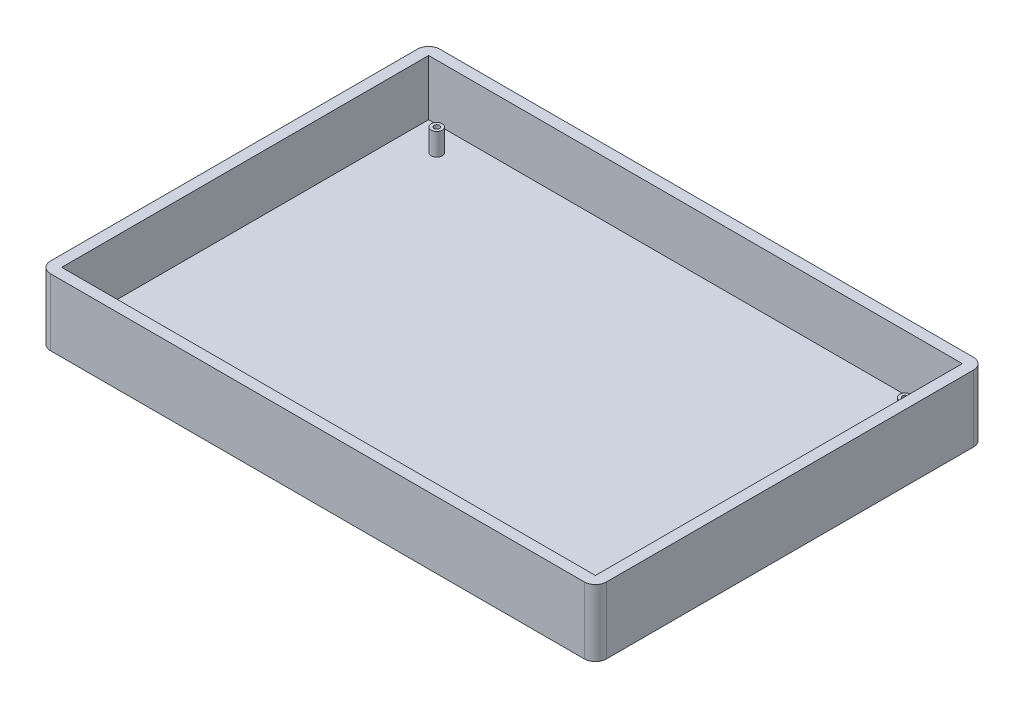
ISO-10303-21;
HEADER;
FILE_DESCRIPTION(('STEP AP214'),'2;1');
FILE_NAME('part.step','',(''),(''),'','','');
FILE_SCHEMA(('AUTOMOTIVE_DESIGN { 1 0 10303 214 1 1 1 1 }'));
ENDSEC;
DATA;
#1=APPLICATION_CONTEXT('core data for automotive mechanical design processes');
#2=APPLICATION_PROTOCOL_DEFINITION('international standard','automotive_design',2000,#1);
#3=PRODUCT_CONTEXT('',#1,'mechanical');
#4=PRODUCT('Part','Part','',(#3));
#5=PRODUCT_RELATED_PRODUCT_CATEGORY('part','',(#4));
#6=PRODUCT_DEFINITION_FORMATION('','',#4);
#7=PRODUCT_DEFINITION_CONTEXT('part definition',#1,'design');
#8=PRODUCT_DEFINITION('design','',#6,#7);
#9=PRODUCT_DEFINITION_SHAPE('','',#8);
#10=(LENGTH_UNIT() NAMED_UNIT(*) SI_UNIT(.MILLI.,.METRE.));
#11=(NAMED_UNIT(*) PLANE_ANGLE_UNIT() SI_UNIT($,.RADIAN.));
#12=(NAMED_UNIT(*) SI_UNIT($,.STERADIAN.) SOLID_ANGLE_UNIT());
#13=UNCERTAINTY_MEASURE_WITH_UNIT(LENGTH_MEASURE(1.E-05),#10,'distance_accuracy_value','');
#14=(GEOMETRIC_REPRESENTATION_CONTEXT(3) GLOBAL_UNCERTAINTY_ASSIGNED_CONTEXT((#13)) GLOBAL_UNIT_ASSIGNED_CONTEXT((#10,
#11,#12)) REPRESENTATION_CONTEXT('',''));
#15=CARTESIAN_POINT('',(0.,0.,0.));
#16=DIRECTION('',(0.,0.,1.));
#17=DIRECTION('',(1.,0.,0.));
#18=AXIS2_PLACEMENT_3D('',#15,#16,#17);
#19=CARTESIAN_POINT('',(125.,30.,87.5));
#20=DIRECTION('',(-1.,0.,0.));
#21=DIRECTION('',(0.,0.,1.));
#22=AXIS2_PLACEMENT_3D('',#19,#20,#21);
#23=PLANE('',#22);
#24=DIRECTION('',(0.,0.,-1.));
#25=VECTOR('',#24,1.);
#26=CARTESIAN_POINT('',(125.,30.,87.5));
#27=LINE('',#26,#25);
#28=CARTESIAN_POINT('',(125.,30.,82.5));
#29=VERTEX_POINT('',#28);
#30=CARTESIAN_POINT('',(125.,30.,-82.5));
#31=VERTEX_POINT('',#30);
#32=EDGE_CURVE('E186',#29,#31,#27,.T.);
#33=ORIENTED_EDGE('',*,*,#32,.F.);
#34=DIRECTION('',(0.,-1.,0.));
#35=VECTOR('',#34,1.);
#36=CARTESIAN_POINT('',(125.,30.,82.5));
#37=LINE('',#36,#35);
#38=CARTESIAN_POINT('',(125.,0.,82.5));
#39=VERTEX_POINT('',#38);
#40=EDGE_CURVE('E218',#29,#39,#37,.T.);
#41=ORIENTED_EDGE('',*,*,#40,.T.);
#42=DIRECTION('',(0.,0.,-1.));
#43=VECTOR('',#42,1.);
#44=CARTESIAN_POINT('',(125.,0.,87.5));
#45=LINE('',#44,#43);
#46=CARTESIAN_POINT('',(125.,0.,-82.5));
#47=VERTEX_POINT('',#46);
#48=EDGE_CURVE('E180',#39,#47,#45,.T.);
#49=ORIENTED_EDGE('',*,*,#48,.T.);
#50=DIRECTION('',(0.,-1.,0.));
#51=VECTOR('',#50,1.);
#52=CARTESIAN_POINT('',(125.,30.,-82.5));
#53=LINE('',#52,#51);
#54=EDGE_CURVE('E202',#47,#31,#53,.F.);
#55=ORIENTED_EDGE('',*,*,#54,.T.);
#56=EDGE_LOOP('',(#33,#41,#49,#55));
#57=FACE_BOUND('',#56,.T.);
#58=ADVANCED_FACE('F39',(#57),#23,.F.);
#59=CARTESIAN_POINT('',(-125.,30.,-87.5));
#60=DIRECTION('',(0.,0.,1.));
#61=DIRECTION('',(1.,0.,0.));
#62=AXIS2_PLACEMENT_3D('',#59,#60,#61);
#63=PLANE('',#62);
#64=DIRECTION('',(-1.,0.,0.));
#65=VECTOR('',#64,1.);
#66=CARTESIAN_POINT('',(-125.,30.,-87.5));
#67=LINE('',#66,#65);
#68=CARTESIAN_POINT('',(120.,30.,-87.5));
#69=VERTEX_POINT('',#68);
#70=CARTESIAN_POINT('',(-120.,30.,-87.5));
#71=VERTEX_POINT('',#70);
#72=EDGE_CURVE('E190',#69,#71,#67,.T.);
#73=ORIENTED_EDGE('',*,*,#72,.F.);
#74=DIRECTION('',(0.,-1.,0.));
#75=VECTOR('',#74,1.);
#76=CARTESIAN_POINT('',(120.,30.,-87.5));
#77=LINE('',#76,#75);
#78=CARTESIAN_POINT('',(120.,0.,-87.5));
#79=VERTEX_POINT('',#78);
#80=EDGE_CURVE('E262',#69,#79,#77,.T.);
#81=ORIENTED_EDGE('',*,*,#80,.T.);
#82=DIRECTION('',(-1.,0.,0.));
#83=VECTOR('',#82,1.);
#84=CARTESIAN_POINT('',(-125.,0.,-87.5));
#85=LINE('',#84,#83);
#86=CARTESIAN_POINT('',(-120.,0.,-87.5));
#87=VERTEX_POINT('',#86);
#88=EDGE_CURVE('E206',#79,#87,#85,.T.);
#89=ORIENTED_EDGE('',*,*,#88,.T.);
#90=DIRECTION('',(0.,-1.,0.));
#91=VECTOR('',#90,1.);
#92=CARTESIAN_POINT('',(-120.,30.,-87.5));
#93=LINE('',#92,#91);
#94=EDGE_CURVE('E259',#87,#71,#93,.F.);
#95=ORIENTED_EDGE('',*,*,#94,.T.);
#96=EDGE_LOOP('',(#73,#81,#89,#95));
#97=FACE_BOUND('',#96,.T.);
#98=ADVANCED_FACE('F306',(#97),#63,.F.);
#99=CARTESIAN_POINT('',(-125.,30.,87.5));
#100=DIRECTION('',(1.,0.,0.));
#101=DIRECTION('',(0.,0.,-1.));
#102=AXIS2_PLACEMENT_3D('',#99,#100,#101);
#103=PLANE('',#102);
#104=DIRECTION('',(0.,0.,1.));
#105=VECTOR('',#104,1.);
#106=CARTESIAN_POINT('',(-125.,0.,87.5));
#107=LINE('',#106,#105);
#108=CARTESIAN_POINT('',(-125.,0.,-82.5));
#109=VERTEX_POINT('',#108);
#110=CARTESIAN_POINT('',(-125.,0.,82.5));
#111=VERTEX_POINT('',#110);
#112=EDGE_CURVE('E210',#109,#111,#107,.T.);
#113=ORIENTED_EDGE('',*,*,#112,.T.);
#114=DIRECTION('',(0.,-1.,0.));
#115=VECTOR('',#114,1.);
#116=CARTESIAN_POINT('',(-125.,30.,82.5));
#117=LINE('',#116,#115);
#118=CARTESIAN_POINT('',(-125.,30.,82.5));
#119=VERTEX_POINT('',#118);
#120=EDGE_CURVE('E63',#111,#119,#117,.F.);
#121=ORIENTED_EDGE('',*,*,#120,.T.);
#122=DIRECTION('',(0.,0.,1.));
#123=VECTOR('',#122,1.);
#124=CARTESIAN_POINT('',(-125.,30.,87.5));
#125=LINE('',#124,#123);
#126=CARTESIAN_POINT('',(-125.,30.,-82.5));
#127=VERTEX_POINT('',#126);
#128=EDGE_CURVE('E195',#127,#119,#125,.T.);
#129=ORIENTED_EDGE('',*,*,#128,.F.);
#130=DIRECTION('',(0.,-1.,0.));
#131=VECTOR('',#130,1.);
#132=CARTESIAN_POINT('',(-125.,30.,-82.5));
#133=LINE('',#132,#131);
#134=EDGE_CURVE('E253',#127,#109,#133,.T.);
#135=ORIENTED_EDGE('',*,*,#134,.T.);
#136=EDGE_LOOP('',(#113,#121,#129,#135));
#137=FACE_BOUND('',#136,.T.);
#138=ADVANCED_FACE('F312',(#137),#103,.F.);
#139=CARTESIAN_POINT('',(-125.,30.,87.5));
#140=DIRECTION('',(0.,0.,-1.));
#141=DIRECTION('',(-1.,0.,0.));
#142=AXIS2_PLACEMENT_3D('',#139,#140,#141);
#143=PLANE('',#142);
#144=DIRECTION('',(1.,0.,0.));
#145=VECTOR('',#144,1.);
#146=CARTESIAN_POINT('',(-125.,0.,87.5));
#147=LINE('',#146,#145);
#148=CARTESIAN_POINT('',(-120.,0.,87.5));
#149=VERTEX_POINT('',#148);
#150=CARTESIAN_POINT('',(120.,0.,87.5));
#151=VERTEX_POINT('',#150);
#152=EDGE_CURVE('E191',#149,#151,#147,.T.);
#153=ORIENTED_EDGE('',*,*,#152,.T.);
#154=DIRECTION('',(0.,-1.,0.));
#155=VECTOR('',#154,1.);
#156=CARTESIAN_POINT('',(120.,30.,87.5));
#157=LINE('',#156,#155);
#158=CARTESIAN_POINT('',(120.,30.,87.5));
#159=VERTEX_POINT('',#158);
#160=EDGE_CURVE('E238',#151,#159,#157,.F.);
#161=ORIENTED_EDGE('',*,*,#160,.T.);
#162=DIRECTION('',(1.,0.,0.));
#163=VECTOR('',#162,1.);
#164=CARTESIAN_POINT('',(-125.,30.,87.5));
#165=LINE('',#164,#163);
#166=CARTESIAN_POINT('',(-120.,30.,87.5));
#167=VERTEX_POINT('',#166);
#168=EDGE_CURVE('E198',#167,#159,#165,.T.);
#169=ORIENTED_EDGE('',*,*,#168,.F.);
#170=DIRECTION('',(0.,-1.,0.));
#171=VECTOR('',#170,1.);
#172=CARTESIAN_POINT('',(-120.,30.,87.5));
#173=LINE('',#172,#171);
#174=EDGE_CURVE('E234',#167,#149,#173,.T.);
#175=ORIENTED_EDGE('',*,*,#174,.T.);
#176=EDGE_LOOP('',(#153,#161,#169,#175));
#177=FACE_BOUND('',#176,.T.);
#178=ADVANCED_FACE('F351',(#177),#143,.F.);
#179=CARTESIAN_POINT('',(0.,30.,0.));
#180=DIRECTION('',(0.,-1.,0.));
#181=DIRECTION('',(0.,0.,-1.));
#182=AXIS2_PLACEMENT_3D('',#179,#180,#181);
#183=PLANE('',#182);
#184=DIRECTION('',(-1.,0.,0.));
#185=VECTOR('',#184,1.);
#186=CARTESIAN_POINT('',(120.,30.,-82.5));
#187=LINE('',#186,#185);
#188=CARTESIAN_POINT('',(120.,30.,-82.5));
#189=VERTEX_POINT('',#188);
#190=CARTESIAN_POINT('',(-120.,30.,-82.5));
#191=VERTEX_POINT('',#190);
#192=EDGE_CURVE('E170',#189,#191,#187,.T.);
#193=ORIENTED_EDGE('',*,*,#192,.F.);
#194=DIRECTION('',(0.,0.,-1.));
#195=VECTOR('',#194,1.);
#196=CARTESIAN_POINT('',(120.,30.,82.5));
#197=LINE('',#196,#195);
#198=CARTESIAN_POINT('',(120.,30.,82.5));
#199=VERTEX_POINT('',#198);
#200=EDGE_CURVE('E55',#199,#189,#197,.T.);
#201=ORIENTED_EDGE('',*,*,#200,.F.);
#202=DIRECTION('',(1.,0.,0.));
#203=VECTOR('',#202,1.);
#204=CARTESIAN_POINT('',(-120.,30.,82.5));
#205=LINE('',#204,#203);
#206=CARTESIAN_POINT('',(-120.,30.,82.5));
#207=VERTEX_POINT('',#206);
#208=EDGE_CURVE('E154',#207,#199,#205,.T.);
#209=ORIENTED_EDGE('',*,*,#208,.F.);
#210=DIRECTION('',(0.,0.,1.));
#211=VECTOR('',#210,1.);
#212=CARTESIAN_POINT('',(-120.,30.,-82.5));
#213=LINE('',#212,#211);
#214=EDGE_CURVE('E158',#191,#207,#213,.T.);
#215=ORIENTED_EDGE('',*,*,#214,.F.);
#216=EDGE_LOOP('',(#193,#201,#209,#215));
#217=FACE_BOUND('',#216,.T.);
#218=ORIENTED_EDGE('',*,*,#168,.T.);
#219=CARTESIAN_POINT('',(120.,30.,82.5));
#220=DIRECTION('',(0.,-1.,0.));
#221=DIRECTION('',(0.,0.,-1.));
#222=AXIS2_PLACEMENT_3D('',#219,#220,#221);
#223=CIRCLE('',#222,5.);
#224=EDGE_CURVE('E250',#159,#29,#223,.F.);
#225=ORIENTED_EDGE('',*,*,#224,.T.);
#226=ORIENTED_EDGE('',*,*,#32,.T.);
#227=CARTESIAN_POINT('',(120.,30.,-82.5));
#228=DIRECTION('',(0.,-1.,0.));
#229=DIRECTION('',(0.,0.,-1.));
#230=AXIS2_PLACEMENT_3D('',#227,#228,#229);
#231=CIRCLE('',#230,5.);
#232=EDGE_CURVE('E244',#31,#69,#231,.F.);
#233=ORIENTED_EDGE('',*,*,#232,.T.);
#234=ORIENTED_EDGE('',*,*,#72,.T.);
#235=CARTESIAN_POINT('',(-120.,30.,-82.5));
#236=DIRECTION('',(0.,-1.,0.));
#237=DIRECTION('',(0.,0.,-1.));
#238=AXIS2_PLACEMENT_3D('',#235,#236,#237);
#239=CIRCLE('',#238,5.);
#240=EDGE_CURVE('E241',#71,#127,#239,.F.);
#241=ORIENTED_EDGE('',*,*,#240,.T.);
#242=ORIENTED_EDGE('',*,*,#128,.T.);
#243=CARTESIAN_POINT('',(-120.,30.,82.5));
#244=DIRECTION('',(0.,-1.,0.));
#245=DIRECTION('',(0.,0.,-1.));
#246=AXIS2_PLACEMENT_3D('',#243,#244,#245);
#247=CIRCLE('',#246,5.);
#248=EDGE_CURVE('E247',#119,#167,#247,.F.);
#249=ORIENTED_EDGE('',*,*,#248,.T.);
#250=EDGE_LOOP('',(#218,#225,#226,#233,#234,#241,#242,#249));
#251=FACE_BOUND('',#250,.T.);
#252=ADVANCED_FACE('F338',(#217,#251),#183,.F.);
#253=CARTESIAN_POINT('',(0.,0.,0.));
#254=DIRECTION('',(0.,-1.,0.));
#255=DIRECTION('',(0.,0.,-1.));
#256=AXIS2_PLACEMENT_3D('',#253,#254,#255);
#257=PLANE('',#256);
#258=ORIENTED_EDGE('',*,*,#48,.F.);
#259=CARTESIAN_POINT('',(120.,0.,82.5));
#260=DIRECTION('',(0.,-1.,0.));
#261=DIRECTION('',(0.,0.,-1.));
#262=AXIS2_PLACEMENT_3D('',#259,#260,#261);
#263=CIRCLE('',#262,5.);
#264=EDGE_CURVE('E231',#39,#151,#263,.T.);
#265=ORIENTED_EDGE('',*,*,#264,.T.);
#266=ORIENTED_EDGE('',*,*,#152,.F.);
#267=CARTESIAN_POINT('',(-120.,0.,82.5));
#268=DIRECTION('',(0.,-1.,0.));
#269=DIRECTION('',(0.,0.,-1.));
#270=AXIS2_PLACEMENT_3D('',#267,#268,#269);
#271=CIRCLE('',#270,5.);
#272=EDGE_CURVE('E228',#149,#111,#271,.T.);
#273=ORIENTED_EDGE('',*,*,#272,.T.);
#274=ORIENTED_EDGE('',*,*,#112,.F.);
#275=CARTESIAN_POINT('',(-120.,0.,-82.5));
#276=DIRECTION('',(0.,-1.,0.));
#277=DIRECTION('',(0.,0.,-1.));
#278=AXIS2_PLACEMENT_3D('',#275,#276,#277);
#279=CIRCLE('',#278,5.);
#280=EDGE_CURVE('E222',#109,#87,#279,.T.);
#281=ORIENTED_EDGE('',*,*,#280,.T.);
#282=ORIENTED_EDGE('',*,*,#88,.F.);
#283=CARTESIAN_POINT('',(120.,0.,-82.5));
#284=DIRECTION('',(0.,-1.,0.));
#285=DIRECTION('',(0.,0.,-1.));
#286=AXIS2_PLACEMENT_3D('',#283,#284,#285);
#287=CIRCLE('',#286,5.);
#288=EDGE_CURVE('E225',#79,#47,#287,.T.);
#289=ORIENTED_EDGE('',*,*,#288,.T.);
#290=EDGE_LOOP('',(#258,#265,#266,#273,#274,#281,#282,#289));
#291=FACE_BOUND('',#290,.T.);
#292=ADVANCED_FACE('F322',(#291),#257,.T.);
#293=CARTESIAN_POINT('',(120.,30.,82.5));
#294=DIRECTION('',(0.,-1.,0.));
#295=DIRECTION('',(0.,0.,-1.));
#296=AXIS2_PLACEMENT_3D('',#293,#294,#295);
#297=CYLINDRICAL_SURFACE('',#296,5.);
#298=ORIENTED_EDGE('',*,*,#224,.F.);
#299=ORIENTED_EDGE('',*,*,#160,.F.);
#300=ORIENTED_EDGE('',*,*,#264,.F.);
#301=ORIENTED_EDGE('',*,*,#40,.F.);
#302=EDGE_LOOP('',(#298,#299,#300,#301));
#303=FACE_BOUND('',#302,.T.);
#304=ADVANCED_FACE('F318',(#303),#297,.T.);
#305=CARTESIAN_POINT('',(-120.,30.,82.5));
#306=DIRECTION('',(0.,-1.,0.));
#307=DIRECTION('',(0.,0.,-1.));
#308=AXIS2_PLACEMENT_3D('',#305,#306,#307);
#309=CYLINDRICAL_SURFACE('',#308,5.);
#310=ORIENTED_EDGE('',*,*,#248,.F.);
#311=ORIENTED_EDGE('',*,*,#120,.F.);
#312=ORIENTED_EDGE('',*,*,#272,.F.);
#313=ORIENTED_EDGE('',*,*,#174,.F.);
#314=EDGE_LOOP('',(#310,#311,#312,#313));
#315=FACE_BOUND('',#314,.T.);
#316=ADVANCED_FACE('F321',(#315),#309,.T.);
#317=CARTESIAN_POINT('',(120.,30.,-82.5));
#318=DIRECTION('',(0.,-1.,0.));
#319=DIRECTION('',(0.,0.,-1.));
#320=AXIS2_PLACEMENT_3D('',#317,#318,#319);
#321=CYLINDRICAL_SURFACE('',#320,5.);
#322=ORIENTED_EDGE('',*,*,#232,.F.);
#323=ORIENTED_EDGE('',*,*,#54,.F.);
#324=ORIENTED_EDGE('',*,*,#288,.F.);
#325=ORIENTED_EDGE('',*,*,#80,.F.);
#326=EDGE_LOOP('',(#322,#323,#324,#325));
#327=FACE_BOUND('',#326,.T.);
#328=ADVANCED_FACE('F325',(#327),#321,.T.);
#329=CARTESIAN_POINT('',(-120.,30.,-82.5));
#330=DIRECTION('',(0.,-1.,0.));
#331=DIRECTION('',(0.,0.,-1.));
#332=AXIS2_PLACEMENT_3D('',#329,#330,#331);
#333=CYLINDRICAL_SURFACE('',#332,5.);
#334=ORIENTED_EDGE('',*,*,#240,.F.);
#335=ORIENTED_EDGE('',*,*,#94,.F.);
#336=ORIENTED_EDGE('',*,*,#280,.F.);
#337=ORIENTED_EDGE('',*,*,#134,.F.);
#338=EDGE_LOOP('',(#334,#335,#336,#337));
#339=FACE_BOUND('',#338,.T.);
#340=ADVANCED_FACE('F41',(#339),#333,.T.);
#341=CARTESIAN_POINT('',(120.,5.,82.5));
#342=DIRECTION('',(1.,0.,0.));
#343=DIRECTION('',(0.,0.,-1.));
#344=AXIS2_PLACEMENT_3D('',#341,#342,#343);
#345=PLANE('',#344);
#346=ORIENTED_EDGE('',*,*,#200,.T.);
#347=DIRECTION('',(0.,1.,0.));
#348=VECTOR('',#347,1.);
#349=CARTESIAN_POINT('',(120.,5.,-82.5));
#350=LINE('',#349,#348);
#351=CARTESIAN_POINT('',(120.,5.,-82.5));
#352=VERTEX_POINT('',#351);
#353=EDGE_CURVE('E129',#352,#189,#350,.T.);
#354=ORIENTED_EDGE('',*,*,#353,.F.);
#355=DIRECTION('',(0.,0.,-1.));
#356=VECTOR('',#355,1.);
#357=CARTESIAN_POINT('',(120.,5.,82.5));
#358=LINE('',#357,#356);
#359=CARTESIAN_POINT('',(120.,5.,82.5));
#360=VERTEX_POINT('',#359);
#361=EDGE_CURVE('E133',#360,#352,#358,.T.);
#362=ORIENTED_EDGE('',*,*,#361,.F.);
#363=DIRECTION('',(0.,1.,0.));
#364=VECTOR('',#363,1.);
#365=CARTESIAN_POINT('',(120.,5.,82.5));
#366=LINE('',#365,#364);
#367=EDGE_CURVE('E177',#360,#199,#366,.T.);
#368=ORIENTED_EDGE('',*,*,#367,.T.);
#369=EDGE_LOOP('',(#346,#354,#362,#368));
#370=FACE_BOUND('',#369,.T.);
#371=ADVANCED_FACE('F131',(#370),#345,.F.);
#372=CARTESIAN_POINT('',(-120.,5.,82.5));
#373=DIRECTION('',(0.,0.,1.));
#374=DIRECTION('',(1.,0.,0.));
#375=AXIS2_PLACEMENT_3D('',#372,#373,#374);
#376=PLANE('',#375);
#377=ORIENTED_EDGE('',*,*,#208,.T.);
#378=ORIENTED_EDGE('',*,*,#367,.F.);
#379=DIRECTION('',(1.,0.,0.));
#380=VECTOR('',#379,1.);
#381=CARTESIAN_POINT('',(-120.,5.,82.5));
#382=LINE('',#381,#380);
#383=CARTESIAN_POINT('',(-120.,5.,82.5));
#384=VERTEX_POINT('',#383);
#385=EDGE_CURVE('E140',#384,#360,#382,.T.);
#386=ORIENTED_EDGE('',*,*,#385,.F.);
#387=DIRECTION('',(0.,1.,0.));
#388=VECTOR('',#387,1.);
#389=CARTESIAN_POINT('',(-120.,5.,82.5));
#390=LINE('',#389,#388);
#391=EDGE_CURVE('E181',#384,#207,#390,.T.);
#392=ORIENTED_EDGE('',*,*,#391,.T.);
#393=EDGE_LOOP('',(#377,#378,#386,#392));
#394=FACE_BOUND('',#393,.T.);
#395=ADVANCED_FACE('F368',(#394),#376,.F.);
#396=CARTESIAN_POINT('',(-120.,5.,-82.5));
#397=DIRECTION('',(-1.,0.,0.));
#398=DIRECTION('',(0.,0.,1.));
#399=AXIS2_PLACEMENT_3D('',#396,#397,#398);
#400=PLANE('',#399);
#401=ORIENTED_EDGE('',*,*,#214,.T.);
#402=ORIENTED_EDGE('',*,*,#391,.F.);
#403=DIRECTION('',(0.,0.,1.));
#404=VECTOR('',#403,1.);
#405=CARTESIAN_POINT('',(-120.,5.,-82.5));
#406=LINE('',#405,#404);
#407=CARTESIAN_POINT('',(-120.,5.,-82.5));
#408=VERTEX_POINT('',#407);
#409=EDGE_CURVE('E149',#408,#384,#406,.T.);
#410=ORIENTED_EDGE('',*,*,#409,.F.);
#411=DIRECTION('',(0.,1.,0.));
#412=VECTOR('',#411,1.);
#413=CARTESIAN_POINT('',(-120.,5.,-82.5));
#414=LINE('',#413,#412);
#415=EDGE_CURVE('E139',#408,#191,#414,.T.);
#416=ORIENTED_EDGE('',*,*,#415,.T.);
#417=EDGE_LOOP('',(#401,#402,#410,#416));
#418=FACE_BOUND('',#417,.T.);
#419=ADVANCED_FACE('F371',(#418),#400,.F.);
#420=CARTESIAN_POINT('',(120.,5.,-82.5));
#421=DIRECTION('',(0.,0.,-1.));
#422=DIRECTION('',(-1.,0.,0.));
#423=AXIS2_PLACEMENT_3D('',#420,#421,#422);
#424=PLANE('',#423);
#425=ORIENTED_EDGE('',*,*,#192,.T.);
#426=ORIENTED_EDGE('',*,*,#415,.F.);
#427=DIRECTION('',(-1.,0.,0.));
#428=VECTOR('',#427,1.);
#429=CARTESIAN_POINT('',(120.,5.,-82.5));
#430=LINE('',#429,#428);
#431=EDGE_CURVE('E143',#352,#408,#430,.T.);
#432=ORIENTED_EDGE('',*,*,#431,.F.);
#433=ORIENTED_EDGE('',*,*,#353,.T.);
#434=EDGE_LOOP('',(#425,#426,#432,#433));
#435=FACE_BOUND('',#434,.T.);
#436=ADVANCED_FACE('F144',(#435),#424,.F.);
#437=CARTESIAN_POINT('',(0.,5.,0.));
#438=DIRECTION('',(0.,1.,0.));
#439=DIRECTION('',(0.,0.,1.));
#440=AXIS2_PLACEMENT_3D('',#437,#438,#439);
#441=PLANE('',#440);
#442=CARTESIAN_POINT('',(-105.355,5.,71.49));
#443=DIRECTION('',(0.,1.,0.));
#444=DIRECTION('',(0.,0.,1.));
#445=AXIS2_PLACEMENT_3D('',#442,#443,#444);
#446=CIRCLE('',#445,2.5);
#447=CARTESIAN_POINT('',(-105.355,5.,73.99));
#448=VERTEX_POINT('',#447);
#449=EDGE_CURVE('E531',#448,#448,#446,.T.);
#450=ORIENTED_EDGE('',*,*,#449,.F.);
#451=EDGE_LOOP('',(#450));
#452=FACE_BOUND('',#451,.T.);
#453=CARTESIAN_POINT('',(105.355,5.,71.49));
#454=DIRECTION('',(0.,1.,0.));
#455=DIRECTION('',(0.,0.,1.));
#456=AXIS2_PLACEMENT_3D('',#453,#454,#455);
#457=CIRCLE('',#456,2.5);
#458=CARTESIAN_POINT('',(105.355,5.,73.99));
#459=VERTEX_POINT('',#458);
#460=EDGE_CURVE('E545',#459,#459,#457,.T.);
#461=ORIENTED_EDGE('',*,*,#460,.F.);
#462=EDGE_LOOP('',(#461));
#463=FACE_BOUND('',#462,.T.);
#464=CARTESIAN_POINT('',(105.355,5.,-71.49));
#465=DIRECTION('',(0.,1.,0.));
#466=DIRECTION('',(0.,0.,1.));
#467=AXIS2_PLACEMENT_3D('',#464,#465,#466);
#468=CIRCLE('',#467,2.5);
#469=CARTESIAN_POINT('',(105.355,5.,-68.99));
#470=VERTEX_POINT('',#469);
#471=EDGE_CURVE('E557',#470,#470,#468,.T.);
#472=ORIENTED_EDGE('',*,*,#471,.F.);
#473=EDGE_LOOP('',(#472));
#474=FACE_BOUND('',#473,.T.);
#475=CARTESIAN_POINT('',(-105.355,5.,-71.49));
#476=DIRECTION('',(0.,1.,0.));
#477=DIRECTION('',(0.,0.,1.));
#478=AXIS2_PLACEMENT_3D('',#475,#476,#477);
#479=CIRCLE('',#478,2.5);
#480=CARTESIAN_POINT('',(-105.355,5.,-68.99));
#481=VERTEX_POINT('',#480);
#482=EDGE_CURVE('E161',#481,#481,#479,.T.);
#483=ORIENTED_EDGE('',*,*,#482,.F.);
#484=EDGE_LOOP('',(#483));
#485=FACE_BOUND('',#484,.T.);
#486=ORIENTED_EDGE('',*,*,#361,.T.);
#487=ORIENTED_EDGE('',*,*,#431,.T.);
#488=ORIENTED_EDGE('',*,*,#409,.T.);
#489=ORIENTED_EDGE('',*,*,#385,.T.);
#490=EDGE_LOOP('',(#486,#487,#488,#489));
#491=FACE_BOUND('',#490,.T.);
#492=ADVANCED_FACE('F151',(#452,#463,#474,#485,#491),#441,.T.);
#493=CARTESIAN_POINT('',(-105.355,15.,-71.49));
#494=DIRECTION('',(0.,1.,0.));
#495=DIRECTION('',(0.,0.,1.));
#496=AXIS2_PLACEMENT_3D('',#493,#494,#495);
#497=PLANE('',#496);
#498=CARTESIAN_POINT('',(-105.355,15.,-71.49));
#499=DIRECTION('',(0.,1.,0.));
#500=DIRECTION('',(0.,0.,1.));
#501=AXIS2_PLACEMENT_3D('',#498,#499,#500);
#502=CIRCLE('',#501,2.5);
#503=CARTESIAN_POINT('',(-105.355,15.,-68.99));
#504=VERTEX_POINT('',#503);
#505=EDGE_CURVE('E171',#504,#504,#502,.T.);
#506=ORIENTED_EDGE('',*,*,#505,.T.);
#507=EDGE_LOOP('',(#506));
#508=FACE_BOUND('',#507,.T.);
#509=CARTESIAN_POINT('',(-105.355,15.,-71.49));
#510=DIRECTION('',(0.,1.,0.));
#511=DIRECTION('',(0.,0.,1.));
#512=AXIS2_PLACEMENT_3D('',#509,#510,#511);
#513=CIRCLE('',#512,1.25);
#514=CARTESIAN_POINT('',(-105.355,15.,-70.24));
#515=VERTEX_POINT('',#514);
#516=EDGE_CURVE('E562',#515,#515,#513,.T.);
#517=ORIENTED_EDGE('',*,*,#516,.F.);
#518=EDGE_LOOP('',(#517));
#519=FACE_BOUND('',#518,.T.);
#520=ADVANCED_FACE('F396',(#508,#519),#497,.T.);
#521=CARTESIAN_POINT('',(-105.355,15.,-71.49));
#522=DIRECTION('',(0.,-1.,0.));
#523=DIRECTION('',(0.,0.,-1.));
#524=AXIS2_PLACEMENT_3D('',#521,#522,#523);
#525=CYLINDRICAL_SURFACE('',#524,2.5);
#526=ORIENTED_EDGE('',*,*,#505,.F.);
#527=EDGE_LOOP('',(#526));
#528=FACE_BOUND('',#527,.T.);
#529=ORIENTED_EDGE('',*,*,#482,.T.);
#530=EDGE_LOOP('',(#529));
#531=FACE_BOUND('',#530,.T.);
#532=ADVANCED_FACE('F403',(#528,#531),#525,.T.);
#533=CARTESIAN_POINT('',(-105.355,15.,-71.49));
#534=DIRECTION('',(0.,-1.,0.));
#535=DIRECTION('',(0.,0.,-1.));
#536=AXIS2_PLACEMENT_3D('',#533,#534,#535);
#537=CYLINDRICAL_SURFACE('',#536,1.25);
#538=ORIENTED_EDGE('',*,*,#516,.T.);
#539=EDGE_LOOP('',(#538));
#540=FACE_BOUND('',#539,.T.);
#541=CARTESIAN_POINT('',(-105.355,5.,-71.49));
#542=DIRECTION('',(0.,1.,0.));
#543=DIRECTION('',(0.,0.,1.));
#544=AXIS2_PLACEMENT_3D('',#541,#542,#543);
#545=CIRCLE('',#544,1.25);
#546=CARTESIAN_POINT('',(-105.355,5.,-70.24));
#547=VERTEX_POINT('',#546);
#548=EDGE_CURVE('E266',#547,#547,#545,.F.);
#549=ORIENTED_EDGE('',*,*,#548,.T.);
#550=EDGE_LOOP('',(#549));
#551=FACE_BOUND('',#550,.T.);
#552=ADVANCED_FACE('F411',(#540,#551),#537,.F.);
#553=ORIENTED_EDGE('',*,*,#548,.F.);
#554=EDGE_LOOP('',(#553));
#555=FACE_BOUND('',#554,.T.);
#556=ADVANCED_FACE('F301',(#555),#441,.T.);
#557=CARTESIAN_POINT('',(105.355,15.,-71.49));
#558=DIRECTION('',(0.,1.,0.));
#559=DIRECTION('',(0.,0.,1.));
#560=AXIS2_PLACEMENT_3D('',#557,#558,#559);
#561=PLANE('',#560);
#562=CARTESIAN_POINT('',(105.355,15.,-71.49));
#563=DIRECTION('',(0.,1.,0.));
#564=DIRECTION('',(0.,0.,1.));
#565=AXIS2_PLACEMENT_3D('',#562,#563,#564);
#566=CIRCLE('',#565,2.5);
#567=CARTESIAN_POINT('',(105.355,15.,-68.99));
#568=VERTEX_POINT('',#567);
#569=EDGE_CURVE('E558',#568,#568,#566,.T.);
#570=ORIENTED_EDGE('',*,*,#569,.T.);
#571=EDGE_LOOP('',(#570));
#572=FACE_BOUND('',#571,.T.);
#573=CARTESIAN_POINT('',(105.355,15.,-71.49));
#574=DIRECTION('',(0.,1.,0.));
#575=DIRECTION('',(0.,0.,1.));
#576=AXIS2_PLACEMENT_3D('',#573,#574,#575);
#577=CIRCLE('',#576,1.25);
#578=CARTESIAN_POINT('',(105.355,15.,-70.24));
#579=VERTEX_POINT('',#578);
#580=EDGE_CURVE('E550',#579,#579,#577,.T.);
#581=ORIENTED_EDGE('',*,*,#580,.F.);
#582=EDGE_LOOP('',(#581));
#583=FACE_BOUND('',#582,.T.);
#584=ADVANCED_FACE('F425',(#572,#583),#561,.T.);
#585=CARTESIAN_POINT('',(105.355,15.,-71.49));
#586=DIRECTION('',(0.,-1.,0.));
#587=DIRECTION('',(0.,0.,-1.));
#588=AXIS2_PLACEMENT_3D('',#585,#586,#587);
#589=CYLINDRICAL_SURFACE('',#588,2.5);
#590=ORIENTED_EDGE('',*,*,#569,.F.);
#591=EDGE_LOOP('',(#590));
#592=FACE_BOUND('',#591,.T.);
#593=ORIENTED_EDGE('',*,*,#471,.T.);
#594=EDGE_LOOP('',(#593));
#595=FACE_BOUND('',#594,.T.);
#596=ADVANCED_FACE('F432',(#592,#595),#589,.T.);
#597=CARTESIAN_POINT('',(105.355,15.,-71.49));
#598=DIRECTION('',(0.,-1.,0.));
#599=DIRECTION('',(0.,0.,-1.));
#600=AXIS2_PLACEMENT_3D('',#597,#598,#599);
#601=CYLINDRICAL_SURFACE('',#600,1.25);
#602=ORIENTED_EDGE('',*,*,#580,.T.);
#603=EDGE_LOOP('',(#602));
#604=FACE_BOUND('',#603,.T.);
#605=CARTESIAN_POINT('',(105.355,5.,-71.49));
#606=DIRECTION('',(0.,1.,0.));
#607=DIRECTION('',(0.,0.,1.));
#608=AXIS2_PLACEMENT_3D('',#605,#606,#607);
#609=CIRCLE('',#608,1.25);
#610=CARTESIAN_POINT('',(105.355,5.,-70.24));
#611=VERTEX_POINT('',#610);
#612=EDGE_CURVE('E270',#611,#611,#609,.F.);
#613=ORIENTED_EDGE('',*,*,#612,.T.);
#614=EDGE_LOOP('',(#613));
#615=FACE_BOUND('',#614,.T.);
#616=ADVANCED_FACE('F299',(#604,#615),#601,.F.);
#617=ORIENTED_EDGE('',*,*,#612,.F.);
#618=EDGE_LOOP('',(#617));
#619=FACE_BOUND('',#618,.T.);
#620=ADVANCED_FACE('F283',(#619),#441,.T.);
#621=CARTESIAN_POINT('',(105.355,15.,71.49));
#622=DIRECTION('',(0.,1.,0.));
#623=DIRECTION('',(0.,0.,1.));
#624=AXIS2_PLACEMENT_3D('',#621,#622,#623);
#625=PLANE('',#624);
#626=CARTESIAN_POINT('',(105.355,15.,71.49));
#627=DIRECTION('',(0.,1.,0.));
#628=DIRECTION('',(0.,0.,1.));
#629=AXIS2_PLACEMENT_3D('',#626,#627,#628);
#630=CIRCLE('',#629,2.5);
#631=CARTESIAN_POINT('',(105.355,15.,73.99));
#632=VERTEX_POINT('',#631);
#633=EDGE_CURVE('E546',#632,#632,#630,.T.);
#634=ORIENTED_EDGE('',*,*,#633,.T.);
#635=EDGE_LOOP('',(#634));
#636=FACE_BOUND('',#635,.T.);
#637=CARTESIAN_POINT('',(105.355,15.,71.49));
#638=DIRECTION('',(0.,1.,0.));
#639=DIRECTION('',(0.,0.,1.));
#640=AXIS2_PLACEMENT_3D('',#637,#638,#639);
#641=CIRCLE('',#640,1.25);
#642=CARTESIAN_POINT('',(105.355,15.,72.74));
#643=VERTEX_POINT('',#642);
#644=EDGE_CURVE('E540',#643,#643,#641,.T.);
#645=ORIENTED_EDGE('',*,*,#644,.F.);
#646=EDGE_LOOP('',(#645));
#647=FACE_BOUND('',#646,.T.);
#648=ADVANCED_FACE('F298',(#636,#647),#625,.T.);
#649=CARTESIAN_POINT('',(105.355,15.,71.49));
#650=DIRECTION('',(0.,-1.,0.));
#651=DIRECTION('',(0.,0.,-1.));
#652=AXIS2_PLACEMENT_3D('',#649,#650,#651);
#653=CYLINDRICAL_SURFACE('',#652,2.5);
#654=ORIENTED_EDGE('',*,*,#633,.F.);
#655=EDGE_LOOP('',(#654));
#656=FACE_BOUND('',#655,.T.);
#657=ORIENTED_EDGE('',*,*,#460,.T.);
#658=EDGE_LOOP('',(#657));
#659=FACE_BOUND('',#658,.T.);
#660=ADVANCED_FACE('F292',(#656,#659),#653,.T.);
#661=CARTESIAN_POINT('',(105.355,15.,71.49));
#662=DIRECTION('',(0.,-1.,0.));
#663=DIRECTION('',(0.,0.,-1.));
#664=AXIS2_PLACEMENT_3D('',#661,#662,#663);
#665=CYLINDRICAL_SURFACE('',#664,1.25);
#666=ORIENTED_EDGE('',*,*,#644,.T.);
#667=EDGE_LOOP('',(#666));
#668=FACE_BOUND('',#667,.T.);
#669=CARTESIAN_POINT('',(105.355,5.,71.49));
#670=DIRECTION('',(0.,1.,0.));
#671=DIRECTION('',(0.,0.,1.));
#672=AXIS2_PLACEMENT_3D('',#669,#670,#671);
#673=CIRCLE('',#672,1.25);
#674=CARTESIAN_POINT('',(105.355,5.,72.74));
#675=VERTEX_POINT('',#674);
#676=EDGE_CURVE('E48',#675,#675,#673,.F.);
#677=ORIENTED_EDGE('',*,*,#676,.T.);
#678=EDGE_LOOP('',(#677));
#679=FACE_BOUND('',#678,.T.);
#680=ADVANCED_FACE('F277',(#668,#679),#665,.F.);
#681=ORIENTED_EDGE('',*,*,#676,.F.);
#682=EDGE_LOOP('',(#681));
#683=FACE_BOUND('',#682,.T.);
#684=ADVANCED_FACE('F279',(#683),#441,.T.);
#685=CARTESIAN_POINT('',(-105.355,15.,71.49));
#686=DIRECTION('',(0.,1.,0.));
#687=DIRECTION('',(0.,0.,1.));
#688=AXIS2_PLACEMENT_3D('',#685,#686,#687);
#689=PLANE('',#688);
#690=CARTESIAN_POINT('',(-105.355,15.,71.49));
#691=DIRECTION('',(0.,1.,0.));
#692=DIRECTION('',(0.,0.,1.));
#693=AXIS2_PLACEMENT_3D('',#690,#691,#692);
#694=CIRCLE('',#693,2.5);
#695=CARTESIAN_POINT('',(-105.355,15.,73.99));
#696=VERTEX_POINT('',#695);
#697=EDGE_CURVE('E535',#696,#696,#694,.T.);
#698=ORIENTED_EDGE('',*,*,#697,.T.);
#699=EDGE_LOOP('',(#698));
#700=FACE_BOUND('',#699,.T.);
#701=CARTESIAN_POINT('',(-105.355,15.,71.49));
#702=DIRECTION('',(0.,1.,0.));
#703=DIRECTION('',(0.,0.,1.));
#704=AXIS2_PLACEMENT_3D('',#701,#702,#703);
#705=CIRCLE('',#704,1.25);
#706=CARTESIAN_POINT('',(-105.355,15.,72.74));
#707=VERTEX_POINT('',#706);
#708=EDGE_CURVE('E527',#707,#707,#705,.T.);
#709=ORIENTED_EDGE('',*,*,#708,.F.);
#710=EDGE_LOOP('',(#709));
#711=FACE_BOUND('',#710,.T.);
#712=ADVANCED_FACE('F281',(#700,#711),#689,.T.);
#713=CARTESIAN_POINT('',(-105.355,15.,71.49));
#714=DIRECTION('',(0.,-1.,0.));
#715=DIRECTION('',(0.,0.,-1.));
#716=AXIS2_PLACEMENT_3D('',#713,#714,#715);
#717=CYLINDRICAL_SURFACE('',#716,2.5);
#718=ORIENTED_EDGE('',*,*,#697,.F.);
#719=EDGE_LOOP('',(#718));
#720=FACE_BOUND('',#719,.T.);
#721=ORIENTED_EDGE('',*,*,#449,.T.);
#722=EDGE_LOOP('',(#721));
#723=FACE_BOUND('',#722,.T.);
#724=ADVANCED_FACE('F289',(#720,#723),#717,.T.);
#725=CARTESIAN_POINT('',(-105.355,15.,71.49));
#726=DIRECTION('',(0.,-1.,0.));
#727=DIRECTION('',(0.,0.,-1.));
#728=AXIS2_PLACEMENT_3D('',#725,#726,#727);
#729=CYLINDRICAL_SURFACE('',#728,1.25);
#730=ORIENTED_EDGE('',*,*,#708,.T.);
#731=EDGE_LOOP('',(#730));
#732=FACE_BOUND('',#731,.T.);
#733=CARTESIAN_POINT('',(-105.355,5.,71.49));
#734=DIRECTION('',(0.,1.,0.));
#735=DIRECTION('',(0.,0.,1.));
#736=AXIS2_PLACEMENT_3D('',#733,#734,#735);
#737=CIRCLE('',#736,1.25);
#738=CARTESIAN_POINT('',(-105.355,5.,72.74));
#739=VERTEX_POINT('',#738);
#740=EDGE_CURVE('E11',#739,#739,#737,.F.);
#741=ORIENTED_EDGE('',*,*,#740,.T.);
#742=EDGE_LOOP('',(#741));
#743=FACE_BOUND('',#742,.T.);
#744=ADVANCED_FACE('F303',(#732,#743),#729,.F.);
#745=ORIENTED_EDGE('',*,*,#740,.F.);
#746=EDGE_LOOP('',(#745));
#747=FACE_BOUND('',#746,.T.);
#748=ADVANCED_FACE('F284',(#747),#441,.T.);
#749=CLOSED_SHELL('',(#58,#98,#138,#178,#252,#292,#304,#316,#328,#340,#371,#395,#419,#436,#492,
#520,#532,#552,#556,#584,#596,#616,#620,#648,#660,#680,#684,#712,#724,#744,#748));
#750=MANIFOLD_SOLID_BREP('B2',#749);
#751=ADVANCED_BREP_SHAPE_REPRESENTATION('',(#18,#750),#14);
#752=SHAPE_DEFINITION_REPRESENTATION(#9,#751);
ENDSEC;
END-ISO-10303-21;
